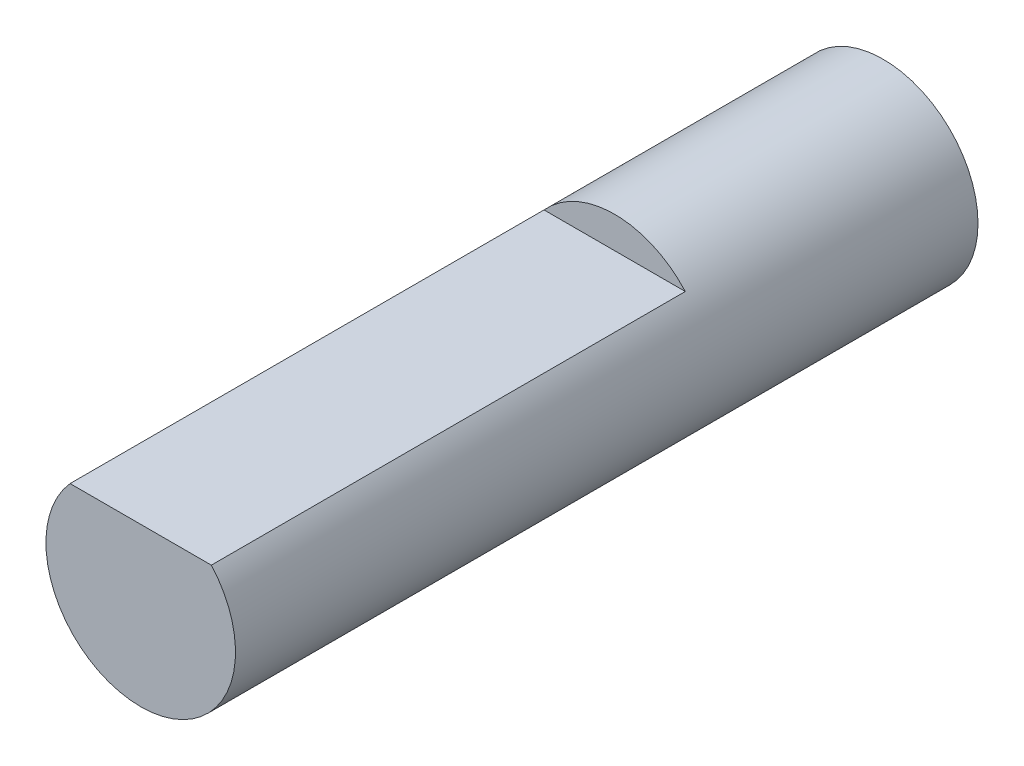
ISO-10303-21;
HEADER;
FILE_DESCRIPTION(('STEP AP214'),'2;1');
FILE_NAME('part.step','',(''),(''),'','','');
FILE_SCHEMA(('AUTOMOTIVE_DESIGN { 1 0 10303 214 1 1 1 1 }'));
ENDSEC;
DATA;
#1=APPLICATION_CONTEXT('core data for automotive mechanical design processes');
#2=APPLICATION_PROTOCOL_DEFINITION('international standard','automotive_design',2000,#1);
#3=PRODUCT_CONTEXT('',#1,'mechanical');
#4=PRODUCT('Part','Part','',(#3));
#5=PRODUCT_RELATED_PRODUCT_CATEGORY('part','',(#4));
#6=PRODUCT_DEFINITION_FORMATION('','',#4);
#7=PRODUCT_DEFINITION_CONTEXT('part definition',#1,'design');
#8=PRODUCT_DEFINITION('design','',#6,#7);
#9=PRODUCT_DEFINITION_SHAPE('','',#8);
#10=(LENGTH_UNIT() NAMED_UNIT(*) SI_UNIT(.MILLI.,.METRE.));
#11=(NAMED_UNIT(*) PLANE_ANGLE_UNIT() SI_UNIT($,.RADIAN.));
#12=(NAMED_UNIT(*) SI_UNIT($,.STERADIAN.) SOLID_ANGLE_UNIT());
#13=UNCERTAINTY_MEASURE_WITH_UNIT(LENGTH_MEASURE(1.E-05),#10,'distance_accuracy_value','');
#14=(GEOMETRIC_REPRESENTATION_CONTEXT(3) GLOBAL_UNCERTAINTY_ASSIGNED_CONTEXT((#13)) GLOBAL_UNIT_ASSIGNED_CONTEXT((#10,
#11,#12)) REPRESENTATION_CONTEXT('',''));
#15=CARTESIAN_POINT('',(0.,0.,0.));
#16=DIRECTION('',(0.,0.,1.));
#17=DIRECTION('',(1.,0.,0.));
#18=AXIS2_PLACEMENT_3D('',#15,#16,#17);
#19=CARTESIAN_POINT('',(0.,0.,29.845));
#20=DIRECTION('',(0.,0.,-1.));
#21=DIRECTION('',(-1.,0.,0.));
#22=AXIS2_PLACEMENT_3D('',#19,#20,#21);
#23=CYLINDRICAL_SURFACE('',#22,3.81);
#24=CARTESIAN_POINT('',(0.,0.,29.845));
#25=DIRECTION('',(0.,0.,1.));
#26=DIRECTION('',(1.,0.,0.));
#27=AXIS2_PLACEMENT_3D('',#24,#25,#26);
#28=CIRCLE('',#27,3.81);
#29=CARTESIAN_POINT('',(-2.83980633142473,2.54,29.845));
#30=VERTEX_POINT('',#29);
#31=CARTESIAN_POINT('',(2.83980633142473,2.54,29.845));
#32=VERTEX_POINT('',#31);
#33=EDGE_CURVE('E11',#30,#32,#28,.T.);
#34=ORIENTED_EDGE('',*,*,#33,.F.);
#35=DIRECTION('',(0.,0.,1.));
#36=VECTOR('',#35,1.);
#37=CARTESIAN_POINT('',(-2.83980633142473,2.54,10.795));
#38=LINE('',#37,#36);
#39=CARTESIAN_POINT('',(-2.83980633142473,2.54,10.795));
#40=VERTEX_POINT('',#39);
#41=EDGE_CURVE('E47',#40,#30,#38,.T.);
#42=ORIENTED_EDGE('',*,*,#41,.F.);
#43=CARTESIAN_POINT('',(0.,0.,10.795));
#44=DIRECTION('',(0.,0.,1.));
#45=DIRECTION('',(1.,0.,0.));
#46=AXIS2_PLACEMENT_3D('',#43,#44,#45);
#47=CIRCLE('',#46,3.81);
#48=CARTESIAN_POINT('',(2.83980633142473,2.54,10.795));
#49=VERTEX_POINT('',#48);
#50=EDGE_CURVE('E62',#49,#40,#47,.T.);
#51=ORIENTED_EDGE('',*,*,#50,.F.);
#52=DIRECTION('',(0.,0.,1.));
#53=VECTOR('',#52,1.);
#54=CARTESIAN_POINT('',(2.83980633142473,2.54,10.795));
#55=LINE('',#54,#53);
#56=EDGE_CURVE('E53',#49,#32,#55,.T.);
#57=ORIENTED_EDGE('',*,*,#56,.T.);
#58=EDGE_LOOP('',(#34,#42,#51,#57));
#59=FACE_BOUND('',#58,.T.);
#60=CARTESIAN_POINT('',(0.,0.,0.));
#61=DIRECTION('',(0.,0.,1.));
#62=DIRECTION('',(1.,0.,0.));
#63=AXIS2_PLACEMENT_3D('',#60,#61,#62);
#64=CIRCLE('',#63,3.81);
#65=CARTESIAN_POINT('',(3.81,0.,0.));
#66=VERTEX_POINT('',#65);
#67=EDGE_CURVE('E36',#66,#66,#64,.T.);
#68=ORIENTED_EDGE('',*,*,#67,.T.);
#69=EDGE_LOOP('',(#68));
#70=FACE_BOUND('',#69,.T.);
#71=ADVANCED_FACE('F33',(#59,#70),#23,.T.);
#72=CARTESIAN_POINT('',(0.,0.,29.845));
#73=DIRECTION('',(0.,0.,1.));
#74=DIRECTION('',(1.,0.,0.));
#75=AXIS2_PLACEMENT_3D('',#72,#73,#74);
#76=PLANE('',#75);
#77=DIRECTION('',(1.,0.,0.));
#78=VECTOR('',#77,1.);
#79=CARTESIAN_POINT('',(0.,2.54,29.845));
#80=LINE('',#79,#78);
#81=EDGE_CURVE('E58',#30,#32,#80,.T.);
#82=ORIENTED_EDGE('',*,*,#81,.F.);
#83=ORIENTED_EDGE('',*,*,#33,.T.);
#84=EDGE_LOOP('',(#82,#83));
#85=FACE_BOUND('',#84,.T.);
#86=ADVANCED_FACE('F68',(#85),#76,.T.);
#87=CARTESIAN_POINT('',(0.,0.,0.));
#88=DIRECTION('',(0.,0.,1.));
#89=DIRECTION('',(1.,0.,0.));
#90=AXIS2_PLACEMENT_3D('',#87,#88,#89);
#91=PLANE('',#90);
#92=ORIENTED_EDGE('',*,*,#67,.F.);
#93=EDGE_LOOP('',(#92));
#94=FACE_BOUND('',#93,.T.);
#95=ADVANCED_FACE('F70',(#94),#91,.F.);
#96=CARTESIAN_POINT('',(0.,2.54,10.795));
#97=DIRECTION('',(0.,-1.,0.));
#98=DIRECTION('',(0.,0.,-1.));
#99=AXIS2_PLACEMENT_3D('',#96,#97,#98);
#100=PLANE('',#99);
#101=ORIENTED_EDGE('',*,*,#81,.T.);
#102=ORIENTED_EDGE('',*,*,#56,.F.);
#103=DIRECTION('',(1.,0.,0.));
#104=VECTOR('',#103,1.);
#105=CARTESIAN_POINT('',(0.,2.54,10.795));
#106=LINE('',#105,#104);
#107=EDGE_CURVE('E85',#40,#49,#106,.T.);
#108=ORIENTED_EDGE('',*,*,#107,.F.);
#109=ORIENTED_EDGE('',*,*,#41,.T.);
#110=EDGE_LOOP('',(#101,#102,#108,#109));
#111=FACE_BOUND('',#110,.T.);
#112=ADVANCED_FACE('F59',(#111),#100,.F.);
#113=CARTESIAN_POINT('',(0.,0.,10.795));
#114=DIRECTION('',(0.,0.,1.));
#115=DIRECTION('',(1.,0.,0.));
#116=AXIS2_PLACEMENT_3D('',#113,#114,#115);
#117=PLANE('',#116);
#118=ORIENTED_EDGE('',*,*,#50,.T.);
#119=ORIENTED_EDGE('',*,*,#107,.T.);
#120=EDGE_LOOP('',(#118,#119));
#121=FACE_BOUND('',#120,.T.);
#122=ADVANCED_FACE('F80',(#121),#117,.T.);
#123=CLOSED_SHELL('',(#71,#86,#95,#112,#122));
#124=MANIFOLD_SOLID_BREP('B2',#123);
#125=ADVANCED_BREP_SHAPE_REPRESENTATION('',(#18,#124),#14);
#126=SHAPE_DEFINITION_REPRESENTATION(#9,#125);
ENDSEC;
END-ISO-10303-21;
